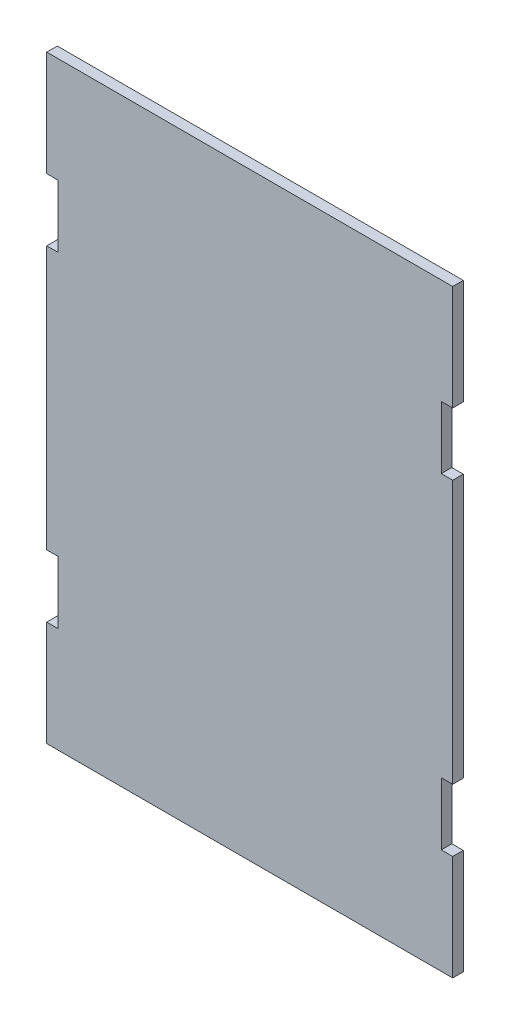
ISO-10303-21;
HEADER;
FILE_DESCRIPTION(('STEP AP214'),'2;1');
FILE_NAME('part.step','',(''),(''),'','','');
FILE_SCHEMA(('AUTOMOTIVE_DESIGN { 1 0 10303 214 1 1 1 1 }'));
ENDSEC;
DATA;
#1=APPLICATION_CONTEXT('core data for automotive mechanical design processes');
#2=APPLICATION_PROTOCOL_DEFINITION('international standard','automotive_design',2000,#1);
#3=PRODUCT_CONTEXT('',#1,'mechanical');
#4=PRODUCT('Part','Part','',(#3));
#5=PRODUCT_RELATED_PRODUCT_CATEGORY('part','',(#4));
#6=PRODUCT_DEFINITION_FORMATION('','',#4);
#7=PRODUCT_DEFINITION_CONTEXT('part definition',#1,'design');
#8=PRODUCT_DEFINITION('design','',#6,#7);
#9=PRODUCT_DEFINITION_SHAPE('','',#8);
#10=(LENGTH_UNIT() NAMED_UNIT(*) SI_UNIT(.MILLI.,.METRE.));
#11=(NAMED_UNIT(*) PLANE_ANGLE_UNIT() SI_UNIT($,.RADIAN.));
#12=(NAMED_UNIT(*) SI_UNIT($,.STERADIAN.) SOLID_ANGLE_UNIT());
#13=UNCERTAINTY_MEASURE_WITH_UNIT(LENGTH_MEASURE(1.E-05),#10,'distance_accuracy_value','');
#14=(GEOMETRIC_REPRESENTATION_CONTEXT(3) GLOBAL_UNCERTAINTY_ASSIGNED_CONTEXT((#13)) GLOBAL_UNIT_ASSIGNED_CONTEXT((#10,
#11,#12)) REPRESENTATION_CONTEXT('',''));
#15=CARTESIAN_POINT('',(0.,0.,0.));
#16=DIRECTION('',(0.,0.,1.));
#17=DIRECTION('',(1.,0.,0.));
#18=AXIS2_PLACEMENT_3D('',#15,#16,#17);
#19=CARTESIAN_POINT('',(-230.5,220.5,12.));
#20=DIRECTION('',(1.,0.,0.));
#21=DIRECTION('',(0.,0.,-1.));
#22=AXIS2_PLACEMENT_3D('',#19,#20,#21);
#23=PLANE('',#22);
#24=DIRECTION('',(0.,-1.,0.));
#25=VECTOR('',#24,1.);
#26=CARTESIAN_POINT('',(-230.5,220.5,0.));
#27=LINE('',#26,#25);
#28=CARTESIAN_POINT('',(-230.5,340.,0.));
#29=VERTEX_POINT('',#28);
#30=CARTESIAN_POINT('',(-230.5,220.5,0.));
#31=VERTEX_POINT('',#30);
#32=EDGE_CURVE('E201',#29,#31,#27,.T.);
#33=ORIENTED_EDGE('',*,*,#32,.T.);
#34=DIRECTION('',(0.,0.,-1.));
#35=VECTOR('',#34,1.);
#36=CARTESIAN_POINT('',(-230.5,220.5,12.));
#37=LINE('',#36,#35);
#38=CARTESIAN_POINT('',(-230.5,220.5,12.));
#39=VERTEX_POINT('',#38);
#40=EDGE_CURVE('E11',#39,#31,#37,.T.);
#41=ORIENTED_EDGE('',*,*,#40,.F.);
#42=DIRECTION('',(0.,-1.,0.));
#43=VECTOR('',#42,1.);
#44=CARTESIAN_POINT('',(-230.5,220.5,12.));
#45=LINE('',#44,#43);
#46=CARTESIAN_POINT('',(-230.5,340.,12.));
#47=VERTEX_POINT('',#46);
#48=EDGE_CURVE('E239',#47,#39,#45,.T.);
#49=ORIENTED_EDGE('',*,*,#48,.F.);
#50=DIRECTION('',(0.,0.,-1.));
#51=VECTOR('',#50,1.);
#52=CARTESIAN_POINT('',(-230.5,340.,12.));
#53=LINE('',#52,#51);
#54=EDGE_CURVE('E197',#47,#29,#53,.T.);
#55=ORIENTED_EDGE('',*,*,#54,.T.);
#56=EDGE_LOOP('',(#33,#41,#49,#55));
#57=FACE_BOUND('',#56,.T.);
#58=ADVANCED_FACE('F33',(#57),#23,.F.);
#59=CARTESIAN_POINT('',(-230.5,220.5,12.));
#60=DIRECTION('',(0.,1.,0.));
#61=DIRECTION('',(0.,0.,1.));
#62=AXIS2_PLACEMENT_3D('',#59,#60,#61);
#63=PLANE('',#62);
#64=DIRECTION('',(1.,0.,0.));
#65=VECTOR('',#64,1.);
#66=CARTESIAN_POINT('',(-230.5,220.5,0.));
#67=LINE('',#66,#65);
#68=CARTESIAN_POINT('',(-217.5,220.5,0.));
#69=VERTEX_POINT('',#68);
#70=EDGE_CURVE('E204',#31,#69,#67,.T.);
#71=ORIENTED_EDGE('',*,*,#70,.T.);
#72=DIRECTION('',(0.,0.,-1.));
#73=VECTOR('',#72,1.);
#74=CARTESIAN_POINT('',(-217.5,220.5,12.));
#75=LINE('',#74,#73);
#76=CARTESIAN_POINT('',(-217.5,220.5,12.));
#77=VERTEX_POINT('',#76);
#78=EDGE_CURVE('E41',#77,#69,#75,.T.);
#79=ORIENTED_EDGE('',*,*,#78,.F.);
#80=DIRECTION('',(1.,0.,0.));
#81=VECTOR('',#80,1.);
#82=CARTESIAN_POINT('',(-230.5,220.5,12.));
#83=LINE('',#82,#81);
#84=EDGE_CURVE('E128',#39,#77,#83,.T.);
#85=ORIENTED_EDGE('',*,*,#84,.F.);
#86=ORIENTED_EDGE('',*,*,#40,.T.);
#87=EDGE_LOOP('',(#71,#79,#85,#86));
#88=FACE_BOUND('',#87,.T.);
#89=ADVANCED_FACE('F357',(#88),#63,.F.);
#90=CARTESIAN_POINT('',(-217.5,220.5,12.));
#91=DIRECTION('',(1.,0.,0.));
#92=DIRECTION('',(0.,0.,-1.));
#93=AXIS2_PLACEMENT_3D('',#90,#91,#92);
#94=PLANE('',#93);
#95=DIRECTION('',(0.,-1.,0.));
#96=VECTOR('',#95,1.);
#97=CARTESIAN_POINT('',(-217.5,220.5,0.));
#98=LINE('',#97,#96);
#99=CARTESIAN_POINT('',(-217.5,149.5,0.));
#100=VERTEX_POINT('',#99);
#101=EDGE_CURVE('E206',#69,#100,#98,.T.);
#102=ORIENTED_EDGE('',*,*,#101,.T.);
#103=DIRECTION('',(0.,0.,-1.));
#104=VECTOR('',#103,1.);
#105=CARTESIAN_POINT('',(-217.5,149.5,12.));
#106=LINE('',#105,#104);
#107=CARTESIAN_POINT('',(-217.5,149.5,12.));
#108=VERTEX_POINT('',#107);
#109=EDGE_CURVE('E282',#108,#100,#106,.T.);
#110=ORIENTED_EDGE('',*,*,#109,.F.);
#111=DIRECTION('',(0.,-1.,0.));
#112=VECTOR('',#111,1.);
#113=CARTESIAN_POINT('',(-217.5,220.5,12.));
#114=LINE('',#113,#112);
#115=EDGE_CURVE('E290',#77,#108,#114,.T.);
#116=ORIENTED_EDGE('',*,*,#115,.F.);
#117=ORIENTED_EDGE('',*,*,#78,.T.);
#118=EDGE_LOOP('',(#102,#110,#116,#117));
#119=FACE_BOUND('',#118,.T.);
#120=ADVANCED_FACE('F288',(#119),#94,.F.);
#121=CARTESIAN_POINT('',(-217.5,149.5,12.));
#122=DIRECTION('',(0.,-1.,0.));
#123=DIRECTION('',(1.,0.,0.));
#124=AXIS2_PLACEMENT_3D('',#121,#122,#123);
#125=PLANE('',#124);
#126=DIRECTION('',(-1.,0.,0.));
#127=VECTOR('',#126,1.);
#128=CARTESIAN_POINT('',(-217.5,149.5,0.));
#129=LINE('',#128,#127);
#130=CARTESIAN_POINT('',(-230.5,149.5,0.));
#131=VERTEX_POINT('',#130);
#132=EDGE_CURVE('E208',#100,#131,#129,.T.);
#133=ORIENTED_EDGE('',*,*,#132,.T.);
#134=DIRECTION('',(0.,0.,-1.));
#135=VECTOR('',#134,1.);
#136=CARTESIAN_POINT('',(-230.5,149.5,12.));
#137=LINE('',#136,#135);
#138=CARTESIAN_POINT('',(-230.5,149.5,12.));
#139=VERTEX_POINT('',#138);
#140=EDGE_CURVE('E279',#139,#131,#137,.T.);
#141=ORIENTED_EDGE('',*,*,#140,.F.);
#142=DIRECTION('',(-1.,0.,0.));
#143=VECTOR('',#142,1.);
#144=CARTESIAN_POINT('',(-217.5,149.5,12.));
#145=LINE('',#144,#143);
#146=EDGE_CURVE('E308',#108,#139,#145,.T.);
#147=ORIENTED_EDGE('',*,*,#146,.F.);
#148=ORIENTED_EDGE('',*,*,#109,.T.);
#149=EDGE_LOOP('',(#133,#141,#147,#148));
#150=FACE_BOUND('',#149,.T.);
#151=ADVANCED_FACE('F299',(#150),#125,.F.);
#152=CARTESIAN_POINT('',(-230.5,-149.5,12.));
#153=DIRECTION('',(1.,0.,0.));
#154=DIRECTION('',(0.,0.,-1.));
#155=AXIS2_PLACEMENT_3D('',#152,#153,#154);
#156=PLANE('',#155);
#157=DIRECTION('',(0.,-1.,0.));
#158=VECTOR('',#157,1.);
#159=CARTESIAN_POINT('',(-230.5,-149.5,0.));
#160=LINE('',#159,#158);
#161=CARTESIAN_POINT('',(-230.5,-149.5,0.));
#162=VERTEX_POINT('',#161);
#163=EDGE_CURVE('E210',#131,#162,#160,.T.);
#164=ORIENTED_EDGE('',*,*,#163,.T.);
#165=DIRECTION('',(0.,0.,-1.));
#166=VECTOR('',#165,1.);
#167=CARTESIAN_POINT('',(-230.5,-149.5,12.));
#168=LINE('',#167,#166);
#169=CARTESIAN_POINT('',(-230.5,-149.5,12.));
#170=VERTEX_POINT('',#169);
#171=EDGE_CURVE('E276',#170,#162,#168,.T.);
#172=ORIENTED_EDGE('',*,*,#171,.F.);
#173=DIRECTION('',(0.,-1.,0.));
#174=VECTOR('',#173,1.);
#175=CARTESIAN_POINT('',(-230.5,-149.5,12.));
#176=LINE('',#175,#174);
#177=EDGE_CURVE('E305',#139,#170,#176,.T.);
#178=ORIENTED_EDGE('',*,*,#177,.F.);
#179=ORIENTED_EDGE('',*,*,#140,.T.);
#180=EDGE_LOOP('',(#164,#172,#178,#179));
#181=FACE_BOUND('',#180,.T.);
#182=ADVANCED_FACE('F303',(#181),#156,.F.);
#183=CARTESIAN_POINT('',(-230.5,-149.5,12.));
#184=DIRECTION('',(0.,1.,0.));
#185=DIRECTION('',(0.,0.,1.));
#186=AXIS2_PLACEMENT_3D('',#183,#184,#185);
#187=PLANE('',#186);
#188=DIRECTION('',(1.,0.,0.));
#189=VECTOR('',#188,1.);
#190=CARTESIAN_POINT('',(-230.5,-149.5,0.));
#191=LINE('',#190,#189);
#192=CARTESIAN_POINT('',(-217.5,-149.5,0.));
#193=VERTEX_POINT('',#192);
#194=EDGE_CURVE('E212',#162,#193,#191,.T.);
#195=ORIENTED_EDGE('',*,*,#194,.T.);
#196=DIRECTION('',(0.,0.,-1.));
#197=VECTOR('',#196,1.);
#198=CARTESIAN_POINT('',(-217.5,-149.5,12.));
#199=LINE('',#198,#197);
#200=CARTESIAN_POINT('',(-217.5,-149.5,12.));
#201=VERTEX_POINT('',#200);
#202=EDGE_CURVE('E273',#201,#193,#199,.T.);
#203=ORIENTED_EDGE('',*,*,#202,.F.);
#204=DIRECTION('',(1.,0.,0.));
#205=VECTOR('',#204,1.);
#206=CARTESIAN_POINT('',(-230.5,-149.5,12.));
#207=LINE('',#206,#205);
#208=EDGE_CURVE('E307',#170,#201,#207,.T.);
#209=ORIENTED_EDGE('',*,*,#208,.F.);
#210=ORIENTED_EDGE('',*,*,#171,.T.);
#211=EDGE_LOOP('',(#195,#203,#209,#210));
#212=FACE_BOUND('',#211,.T.);
#213=ADVANCED_FACE('F370',(#212),#187,.F.);
#214=CARTESIAN_POINT('',(-217.5,-149.5,12.));
#215=DIRECTION('',(1.,0.,0.));
#216=DIRECTION('',(0.,1.,0.));
#217=AXIS2_PLACEMENT_3D('',#214,#215,#216);
#218=PLANE('',#217);
#219=DIRECTION('',(0.,-1.,0.));
#220=VECTOR('',#219,1.);
#221=CARTESIAN_POINT('',(-217.5,-149.5,0.));
#222=LINE('',#221,#220);
#223=CARTESIAN_POINT('',(-217.5,-220.5,0.));
#224=VERTEX_POINT('',#223);
#225=EDGE_CURVE('E214',#193,#224,#222,.T.);
#226=ORIENTED_EDGE('',*,*,#225,.T.);
#227=DIRECTION('',(0.,0.,-1.));
#228=VECTOR('',#227,1.);
#229=CARTESIAN_POINT('',(-217.5,-220.5,12.));
#230=LINE('',#229,#228);
#231=CARTESIAN_POINT('',(-217.5,-220.5,12.));
#232=VERTEX_POINT('',#231);
#233=EDGE_CURVE('E270',#232,#224,#230,.T.);
#234=ORIENTED_EDGE('',*,*,#233,.F.);
#235=DIRECTION('',(0.,-1.,0.));
#236=VECTOR('',#235,1.);
#237=CARTESIAN_POINT('',(-217.5,-149.5,12.));
#238=LINE('',#237,#236);
#239=EDGE_CURVE('E310',#201,#232,#238,.T.);
#240=ORIENTED_EDGE('',*,*,#239,.F.);
#241=ORIENTED_EDGE('',*,*,#202,.T.);
#242=EDGE_LOOP('',(#226,#234,#240,#241));
#243=FACE_BOUND('',#242,.T.);
#244=ADVANCED_FACE('F373',(#243),#218,.F.);
#245=CARTESIAN_POINT('',(-217.5,-220.5,12.));
#246=DIRECTION('',(0.,-1.,0.));
#247=DIRECTION('',(0.,0.,-1.));
#248=AXIS2_PLACEMENT_3D('',#245,#246,#247);
#249=PLANE('',#248);
#250=DIRECTION('',(-1.,0.,0.));
#251=VECTOR('',#250,1.);
#252=CARTESIAN_POINT('',(-217.5,-220.5,0.));
#253=LINE('',#252,#251);
#254=CARTESIAN_POINT('',(-230.5,-220.5,0.));
#255=VERTEX_POINT('',#254);
#256=EDGE_CURVE('E216',#224,#255,#253,.T.);
#257=ORIENTED_EDGE('',*,*,#256,.T.);
#258=DIRECTION('',(0.,0.,-1.));
#259=VECTOR('',#258,1.);
#260=CARTESIAN_POINT('',(-230.5,-220.5,12.));
#261=LINE('',#260,#259);
#262=CARTESIAN_POINT('',(-230.5,-220.5,12.));
#263=VERTEX_POINT('',#262);
#264=EDGE_CURVE('E267',#263,#255,#261,.T.);
#265=ORIENTED_EDGE('',*,*,#264,.F.);
#266=DIRECTION('',(-1.,0.,0.));
#267=VECTOR('',#266,1.);
#268=CARTESIAN_POINT('',(-217.5,-220.5,12.));
#269=LINE('',#268,#267);
#270=EDGE_CURVE('E316',#232,#263,#269,.T.);
#271=ORIENTED_EDGE('',*,*,#270,.F.);
#272=ORIENTED_EDGE('',*,*,#233,.T.);
#273=EDGE_LOOP('',(#257,#265,#271,#272));
#274=FACE_BOUND('',#273,.T.);
#275=ADVANCED_FACE('F377',(#274),#249,.F.);
#276=CARTESIAN_POINT('',(-230.5,-340.,12.));
#277=DIRECTION('',(1.,0.,0.));
#278=DIRECTION('',(0.,0.,-1.));
#279=AXIS2_PLACEMENT_3D('',#276,#277,#278);
#280=PLANE('',#279);
#281=DIRECTION('',(0.,-1.,0.));
#282=VECTOR('',#281,1.);
#283=CARTESIAN_POINT('',(-230.5,-340.,0.));
#284=LINE('',#283,#282);
#285=CARTESIAN_POINT('',(-230.5,-340.,0.));
#286=VERTEX_POINT('',#285);
#287=EDGE_CURVE('E218',#255,#286,#284,.T.);
#288=ORIENTED_EDGE('',*,*,#287,.T.);
#289=DIRECTION('',(0.,0.,-1.));
#290=VECTOR('',#289,1.);
#291=CARTESIAN_POINT('',(-230.5,-340.,12.));
#292=LINE('',#291,#290);
#293=CARTESIAN_POINT('',(-230.5,-340.,12.));
#294=VERTEX_POINT('',#293);
#295=EDGE_CURVE('E264',#294,#286,#292,.T.);
#296=ORIENTED_EDGE('',*,*,#295,.F.);
#297=DIRECTION('',(0.,-1.,0.));
#298=VECTOR('',#297,1.);
#299=CARTESIAN_POINT('',(-230.5,-340.,12.));
#300=LINE('',#299,#298);
#301=EDGE_CURVE('E318',#263,#294,#300,.T.);
#302=ORIENTED_EDGE('',*,*,#301,.F.);
#303=ORIENTED_EDGE('',*,*,#264,.T.);
#304=EDGE_LOOP('',(#288,#296,#302,#303));
#305=FACE_BOUND('',#304,.T.);
#306=ADVANCED_FACE('F381',(#305),#280,.F.);
#307=CARTESIAN_POINT('',(230.5,-340.,12.));
#308=DIRECTION('',(0.,1.,0.));
#309=DIRECTION('',(-1.,0.,0.));
#310=AXIS2_PLACEMENT_3D('',#307,#308,#309);
#311=PLANE('',#310);
#312=DIRECTION('',(1.,0.,0.));
#313=VECTOR('',#312,1.);
#314=CARTESIAN_POINT('',(230.5,-340.,0.));
#315=LINE('',#314,#313);
#316=CARTESIAN_POINT('',(230.5,-340.,0.));
#317=VERTEX_POINT('',#316);
#318=EDGE_CURVE('E220',#286,#317,#315,.T.);
#319=ORIENTED_EDGE('',*,*,#318,.T.);
#320=DIRECTION('',(0.,0.,-1.));
#321=VECTOR('',#320,1.);
#322=CARTESIAN_POINT('',(230.5,-340.,12.));
#323=LINE('',#322,#321);
#324=CARTESIAN_POINT('',(230.5,-340.,12.));
#325=VERTEX_POINT('',#324);
#326=EDGE_CURVE('E261',#325,#317,#323,.T.);
#327=ORIENTED_EDGE('',*,*,#326,.F.);
#328=DIRECTION('',(1.,0.,0.));
#329=VECTOR('',#328,1.);
#330=CARTESIAN_POINT('',(230.5,-340.,12.));
#331=LINE('',#330,#329);
#332=EDGE_CURVE('E320',#294,#325,#331,.T.);
#333=ORIENTED_EDGE('',*,*,#332,.F.);
#334=ORIENTED_EDGE('',*,*,#295,.T.);
#335=EDGE_LOOP('',(#319,#327,#333,#334));
#336=FACE_BOUND('',#335,.T.);
#337=ADVANCED_FACE('F385',(#336),#311,.F.);
#338=CARTESIAN_POINT('',(230.5,-340.,12.));
#339=DIRECTION('',(-1.,0.,0.));
#340=DIRECTION('',(0.,0.,1.));
#341=AXIS2_PLACEMENT_3D('',#338,#339,#340);
#342=PLANE('',#341);
#343=DIRECTION('',(0.,1.,0.));
#344=VECTOR('',#343,1.);
#345=CARTESIAN_POINT('',(230.5,-340.,0.));
#346=LINE('',#345,#344);
#347=CARTESIAN_POINT('',(230.5,-220.5,0.));
#348=VERTEX_POINT('',#347);
#349=EDGE_CURVE('E222',#317,#348,#346,.T.);
#350=ORIENTED_EDGE('',*,*,#349,.T.);
#351=DIRECTION('',(0.,0.,-1.));
#352=VECTOR('',#351,1.);
#353=CARTESIAN_POINT('',(230.5,-220.5,12.));
#354=LINE('',#353,#352);
#355=CARTESIAN_POINT('',(230.5,-220.5,12.));
#356=VERTEX_POINT('',#355);
#357=EDGE_CURVE('E258',#356,#348,#354,.T.);
#358=ORIENTED_EDGE('',*,*,#357,.F.);
#359=DIRECTION('',(0.,1.,0.));
#360=VECTOR('',#359,1.);
#361=CARTESIAN_POINT('',(230.5,-340.,12.));
#362=LINE('',#361,#360);
#363=EDGE_CURVE('E322',#325,#356,#362,.T.);
#364=ORIENTED_EDGE('',*,*,#363,.F.);
#365=ORIENTED_EDGE('',*,*,#326,.T.);
#366=EDGE_LOOP('',(#350,#358,#364,#365));
#367=FACE_BOUND('',#366,.T.);
#368=ADVANCED_FACE('F389',(#367),#342,.F.);
#369=CARTESIAN_POINT('',(230.5,-220.5,12.));
#370=DIRECTION('',(0.,-1.,0.));
#371=DIRECTION('',(0.,0.,-1.));
#372=AXIS2_PLACEMENT_3D('',#369,#370,#371);
#373=PLANE('',#372);
#374=DIRECTION('',(-1.,0.,0.));
#375=VECTOR('',#374,1.);
#376=CARTESIAN_POINT('',(230.5,-220.5,0.));
#377=LINE('',#376,#375);
#378=CARTESIAN_POINT('',(217.5,-220.5,0.));
#379=VERTEX_POINT('',#378);
#380=EDGE_CURVE('E224',#348,#379,#377,.T.);
#381=ORIENTED_EDGE('',*,*,#380,.T.);
#382=DIRECTION('',(0.,0.,-1.));
#383=VECTOR('',#382,1.);
#384=CARTESIAN_POINT('',(217.5,-220.5,12.));
#385=LINE('',#384,#383);
#386=CARTESIAN_POINT('',(217.5,-220.5,12.));
#387=VERTEX_POINT('',#386);
#388=EDGE_CURVE('E255',#387,#379,#385,.T.);
#389=ORIENTED_EDGE('',*,*,#388,.F.);
#390=DIRECTION('',(-1.,0.,0.));
#391=VECTOR('',#390,1.);
#392=CARTESIAN_POINT('',(230.5,-220.5,12.));
#393=LINE('',#392,#391);
#394=EDGE_CURVE('E324',#356,#387,#393,.T.);
#395=ORIENTED_EDGE('',*,*,#394,.F.);
#396=ORIENTED_EDGE('',*,*,#357,.T.);
#397=EDGE_LOOP('',(#381,#389,#395,#396));
#398=FACE_BOUND('',#397,.T.);
#399=ADVANCED_FACE('F393',(#398),#373,.F.);
#400=CARTESIAN_POINT('',(217.5,-220.5,12.));
#401=DIRECTION('',(-1.,0.,0.));
#402=DIRECTION('',(0.,0.,1.));
#403=AXIS2_PLACEMENT_3D('',#400,#401,#402);
#404=PLANE('',#403);
#405=DIRECTION('',(0.,1.,0.));
#406=VECTOR('',#405,1.);
#407=CARTESIAN_POINT('',(217.5,-220.5,0.));
#408=LINE('',#407,#406);
#409=CARTESIAN_POINT('',(217.5,-149.5,0.));
#410=VERTEX_POINT('',#409);
#411=EDGE_CURVE('E226',#379,#410,#408,.T.);
#412=ORIENTED_EDGE('',*,*,#411,.T.);
#413=DIRECTION('',(0.,0.,-1.));
#414=VECTOR('',#413,1.);
#415=CARTESIAN_POINT('',(217.5,-149.5,12.));
#416=LINE('',#415,#414);
#417=CARTESIAN_POINT('',(217.5,-149.5,12.));
#418=VERTEX_POINT('',#417);
#419=EDGE_CURVE('E252',#418,#410,#416,.T.);
#420=ORIENTED_EDGE('',*,*,#419,.F.);
#421=DIRECTION('',(0.,1.,0.));
#422=VECTOR('',#421,1.);
#423=CARTESIAN_POINT('',(217.5,-220.5,12.));
#424=LINE('',#423,#422);
#425=EDGE_CURVE('E326',#387,#418,#424,.T.);
#426=ORIENTED_EDGE('',*,*,#425,.F.);
#427=ORIENTED_EDGE('',*,*,#388,.T.);
#428=EDGE_LOOP('',(#412,#420,#426,#427));
#429=FACE_BOUND('',#428,.T.);
#430=ADVANCED_FACE('F397',(#429),#404,.F.);
#431=CARTESIAN_POINT('',(217.5,-149.5,12.));
#432=DIRECTION('',(0.,1.,0.));
#433=DIRECTION('',(0.,0.,1.));
#434=AXIS2_PLACEMENT_3D('',#431,#432,#433);
#435=PLANE('',#434);
#436=DIRECTION('',(1.,0.,0.));
#437=VECTOR('',#436,1.);
#438=CARTESIAN_POINT('',(217.5,-149.5,0.));
#439=LINE('',#438,#437);
#440=CARTESIAN_POINT('',(230.5,-149.5,0.));
#441=VERTEX_POINT('',#440);
#442=EDGE_CURVE('E228',#410,#441,#439,.T.);
#443=ORIENTED_EDGE('',*,*,#442,.T.);
#444=DIRECTION('',(0.,0.,-1.));
#445=VECTOR('',#444,1.);
#446=CARTESIAN_POINT('',(230.5,-149.5,12.));
#447=LINE('',#446,#445);
#448=CARTESIAN_POINT('',(230.5,-149.5,12.));
#449=VERTEX_POINT('',#448);
#450=EDGE_CURVE('E249',#449,#441,#447,.T.);
#451=ORIENTED_EDGE('',*,*,#450,.F.);
#452=DIRECTION('',(1.,0.,0.));
#453=VECTOR('',#452,1.);
#454=CARTESIAN_POINT('',(217.5,-149.5,12.));
#455=LINE('',#454,#453);
#456=EDGE_CURVE('E328',#418,#449,#455,.T.);
#457=ORIENTED_EDGE('',*,*,#456,.F.);
#458=ORIENTED_EDGE('',*,*,#419,.T.);
#459=EDGE_LOOP('',(#443,#451,#457,#458));
#460=FACE_BOUND('',#459,.T.);
#461=ADVANCED_FACE('F401',(#460),#435,.F.);
#462=CARTESIAN_POINT('',(230.5,-149.5,12.));
#463=DIRECTION('',(-1.,0.,0.));
#464=DIRECTION('',(0.,0.,1.));
#465=AXIS2_PLACEMENT_3D('',#462,#463,#464);
#466=PLANE('',#465);
#467=DIRECTION('',(0.,1.,0.));
#468=VECTOR('',#467,1.);
#469=CARTESIAN_POINT('',(230.5,-149.5,0.));
#470=LINE('',#469,#468);
#471=CARTESIAN_POINT('',(230.5,149.5,0.));
#472=VERTEX_POINT('',#471);
#473=EDGE_CURVE('E230',#441,#472,#470,.T.);
#474=ORIENTED_EDGE('',*,*,#473,.T.);
#475=DIRECTION('',(0.,0.,-1.));
#476=VECTOR('',#475,1.);
#477=CARTESIAN_POINT('',(230.5,149.5,12.));
#478=LINE('',#477,#476);
#479=CARTESIAN_POINT('',(230.5,149.5,12.));
#480=VERTEX_POINT('',#479);
#481=EDGE_CURVE('E246',#480,#472,#478,.T.);
#482=ORIENTED_EDGE('',*,*,#481,.F.);
#483=DIRECTION('',(0.,1.,0.));
#484=VECTOR('',#483,1.);
#485=CARTESIAN_POINT('',(230.5,-149.5,12.));
#486=LINE('',#485,#484);
#487=EDGE_CURVE('E330',#449,#480,#486,.T.);
#488=ORIENTED_EDGE('',*,*,#487,.F.);
#489=ORIENTED_EDGE('',*,*,#450,.T.);
#490=EDGE_LOOP('',(#474,#482,#488,#489));
#491=FACE_BOUND('',#490,.T.);
#492=ADVANCED_FACE('F405',(#491),#466,.F.);
#493=CARTESIAN_POINT('',(230.5,149.5,12.));
#494=DIRECTION('',(0.,-1.,0.));
#495=DIRECTION('',(0.,0.,-1.));
#496=AXIS2_PLACEMENT_3D('',#493,#494,#495);
#497=PLANE('',#496);
#498=DIRECTION('',(-1.,0.,0.));
#499=VECTOR('',#498,1.);
#500=CARTESIAN_POINT('',(230.5,149.5,0.));
#501=LINE('',#500,#499);
#502=CARTESIAN_POINT('',(217.5,149.5,0.));
#503=VERTEX_POINT('',#502);
#504=EDGE_CURVE('E232',#472,#503,#501,.T.);
#505=ORIENTED_EDGE('',*,*,#504,.T.);
#506=DIRECTION('',(0.,0.,-1.));
#507=VECTOR('',#506,1.);
#508=CARTESIAN_POINT('',(217.5,149.5,12.));
#509=LINE('',#508,#507);
#510=CARTESIAN_POINT('',(217.5,149.5,12.));
#511=VERTEX_POINT('',#510);
#512=EDGE_CURVE('E243',#511,#503,#509,.T.);
#513=ORIENTED_EDGE('',*,*,#512,.F.);
#514=DIRECTION('',(-1.,0.,0.));
#515=VECTOR('',#514,1.);
#516=CARTESIAN_POINT('',(230.5,149.5,12.));
#517=LINE('',#516,#515);
#518=EDGE_CURVE('E332',#480,#511,#517,.T.);
#519=ORIENTED_EDGE('',*,*,#518,.F.);
#520=ORIENTED_EDGE('',*,*,#481,.T.);
#521=EDGE_LOOP('',(#505,#513,#519,#520));
#522=FACE_BOUND('',#521,.T.);
#523=ADVANCED_FACE('F338',(#522),#497,.F.);
#524=CARTESIAN_POINT('',(217.5,149.5,12.));
#525=DIRECTION('',(-1.,0.,0.));
#526=DIRECTION('',(0.,0.,1.));
#527=AXIS2_PLACEMENT_3D('',#524,#525,#526);
#528=PLANE('',#527);
#529=DIRECTION('',(0.,1.,0.));
#530=VECTOR('',#529,1.);
#531=CARTESIAN_POINT('',(217.5,149.5,0.));
#532=LINE('',#531,#530);
#533=CARTESIAN_POINT('',(217.5,220.5,0.));
#534=VERTEX_POINT('',#533);
#535=EDGE_CURVE('E234',#503,#534,#532,.T.);
#536=ORIENTED_EDGE('',*,*,#535,.T.);
#537=DIRECTION('',(0.,0.,-1.));
#538=VECTOR('',#537,1.);
#539=CARTESIAN_POINT('',(217.5,220.5,12.));
#540=LINE('',#539,#538);
#541=CARTESIAN_POINT('',(217.5,220.5,12.));
#542=VERTEX_POINT('',#541);
#543=EDGE_CURVE('E192',#542,#534,#540,.T.);
#544=ORIENTED_EDGE('',*,*,#543,.F.);
#545=DIRECTION('',(0.,1.,0.));
#546=VECTOR('',#545,1.);
#547=CARTESIAN_POINT('',(217.5,149.5,12.));
#548=LINE('',#547,#546);
#549=EDGE_CURVE('E183',#511,#542,#548,.T.);
#550=ORIENTED_EDGE('',*,*,#549,.F.);
#551=ORIENTED_EDGE('',*,*,#512,.T.);
#552=EDGE_LOOP('',(#536,#544,#550,#551));
#553=FACE_BOUND('',#552,.T.);
#554=ADVANCED_FACE('F342',(#553),#528,.F.);
#555=CARTESIAN_POINT('',(217.5,220.5,12.));
#556=DIRECTION('',(0.,1.,0.));
#557=DIRECTION('',(0.,0.,1.));
#558=AXIS2_PLACEMENT_3D('',#555,#556,#557);
#559=PLANE('',#558);
#560=DIRECTION('',(1.,0.,0.));
#561=VECTOR('',#560,1.);
#562=CARTESIAN_POINT('',(217.5,220.5,0.));
#563=LINE('',#562,#561);
#564=CARTESIAN_POINT('',(230.5,220.5,0.));
#565=VERTEX_POINT('',#564);
#566=EDGE_CURVE('E191',#534,#565,#563,.T.);
#567=ORIENTED_EDGE('',*,*,#566,.T.);
#568=DIRECTION('',(0.,0.,-1.));
#569=VECTOR('',#568,1.);
#570=CARTESIAN_POINT('',(230.5,220.5,12.));
#571=LINE('',#570,#569);
#572=CARTESIAN_POINT('',(230.5,220.5,12.));
#573=VERTEX_POINT('',#572);
#574=EDGE_CURVE('E188',#573,#565,#571,.T.);
#575=ORIENTED_EDGE('',*,*,#574,.F.);
#576=DIRECTION('',(1.,0.,0.));
#577=VECTOR('',#576,1.);
#578=CARTESIAN_POINT('',(217.5,220.5,12.));
#579=LINE('',#578,#577);
#580=EDGE_CURVE('E177',#542,#573,#579,.T.);
#581=ORIENTED_EDGE('',*,*,#580,.F.);
#582=ORIENTED_EDGE('',*,*,#543,.T.);
#583=EDGE_LOOP('',(#567,#575,#581,#582));
#584=FACE_BOUND('',#583,.T.);
#585=ADVANCED_FACE('F189',(#584),#559,.F.);
#586=CARTESIAN_POINT('',(230.5,220.5,12.));
#587=DIRECTION('',(-1.,0.,0.));
#588=DIRECTION('',(0.,0.,1.));
#589=AXIS2_PLACEMENT_3D('',#586,#587,#588);
#590=PLANE('',#589);
#591=DIRECTION('',(0.,1.,0.));
#592=VECTOR('',#591,1.);
#593=CARTESIAN_POINT('',(230.5,220.5,0.));
#594=LINE('',#593,#592);
#595=CARTESIAN_POINT('',(230.5,340.,0.));
#596=VERTEX_POINT('',#595);
#597=EDGE_CURVE('E114',#565,#596,#594,.T.);
#598=ORIENTED_EDGE('',*,*,#597,.T.);
#599=DIRECTION('',(0.,0.,-1.));
#600=VECTOR('',#599,1.);
#601=CARTESIAN_POINT('',(230.5,340.,12.));
#602=LINE('',#601,#600);
#603=CARTESIAN_POINT('',(230.5,340.,12.));
#604=VERTEX_POINT('',#603);
#605=EDGE_CURVE('E193',#604,#596,#602,.T.);
#606=ORIENTED_EDGE('',*,*,#605,.F.);
#607=DIRECTION('',(0.,1.,0.));
#608=VECTOR('',#607,1.);
#609=CARTESIAN_POINT('',(230.5,220.5,12.));
#610=LINE('',#609,#608);
#611=EDGE_CURVE('E181',#573,#604,#610,.T.);
#612=ORIENTED_EDGE('',*,*,#611,.F.);
#613=ORIENTED_EDGE('',*,*,#574,.T.);
#614=EDGE_LOOP('',(#598,#606,#612,#613));
#615=FACE_BOUND('',#614,.T.);
#616=ADVANCED_FACE('F195',(#615),#590,.F.);
#617=CARTESIAN_POINT('',(230.5,340.,12.));
#618=DIRECTION('',(0.,-1.,0.));
#619=DIRECTION('',(1.,0.,0.));
#620=AXIS2_PLACEMENT_3D('',#617,#618,#619);
#621=PLANE('',#620);
#622=DIRECTION('',(-1.,0.,0.));
#623=VECTOR('',#622,1.);
#624=CARTESIAN_POINT('',(230.5,340.,0.));
#625=LINE('',#624,#623);
#626=EDGE_CURVE('E120',#596,#29,#625,.T.);
#627=ORIENTED_EDGE('',*,*,#626,.T.);
#628=ORIENTED_EDGE('',*,*,#54,.F.);
#629=DIRECTION('',(-1.,0.,0.));
#630=VECTOR('',#629,1.);
#631=CARTESIAN_POINT('',(230.5,340.,12.));
#632=LINE('',#631,#630);
#633=EDGE_CURVE('E49',#604,#47,#632,.T.);
#634=ORIENTED_EDGE('',*,*,#633,.F.);
#635=ORIENTED_EDGE('',*,*,#605,.T.);
#636=EDGE_LOOP('',(#627,#628,#634,#635));
#637=FACE_BOUND('',#636,.T.);
#638=ADVANCED_FACE('F346',(#637),#621,.F.);
#639=CARTESIAN_POINT('',(0.,0.,12.));
#640=DIRECTION('',(0.,0.,1.));
#641=DIRECTION('',(1.,0.,0.));
#642=AXIS2_PLACEMENT_3D('',#639,#640,#641);
#643=PLANE('',#642);
#644=ORIENTED_EDGE('',*,*,#48,.T.);
#645=ORIENTED_EDGE('',*,*,#84,.T.);
#646=ORIENTED_EDGE('',*,*,#115,.T.);
#647=ORIENTED_EDGE('',*,*,#146,.T.);
#648=ORIENTED_EDGE('',*,*,#177,.T.);
#649=ORIENTED_EDGE('',*,*,#208,.T.);
#650=ORIENTED_EDGE('',*,*,#239,.T.);
#651=ORIENTED_EDGE('',*,*,#270,.T.);
#652=ORIENTED_EDGE('',*,*,#301,.T.);
#653=ORIENTED_EDGE('',*,*,#332,.T.);
#654=ORIENTED_EDGE('',*,*,#363,.T.);
#655=ORIENTED_EDGE('',*,*,#394,.T.);
#656=ORIENTED_EDGE('',*,*,#425,.T.);
#657=ORIENTED_EDGE('',*,*,#456,.T.);
#658=ORIENTED_EDGE('',*,*,#487,.T.);
#659=ORIENTED_EDGE('',*,*,#518,.T.);
#660=ORIENTED_EDGE('',*,*,#549,.T.);
#661=ORIENTED_EDGE('',*,*,#580,.T.);
#662=ORIENTED_EDGE('',*,*,#611,.T.);
#663=ORIENTED_EDGE('',*,*,#633,.T.);
#664=EDGE_LOOP('',(#644,#645,#646,#647,#648,#649,#650,#651,#652,#653,#654,#655,#656,#657,#658,
#659,#660,#661,#662,#663));
#665=FACE_BOUND('',#664,.T.);
#666=ADVANCED_FACE('F179',(#665),#643,.T.);
#667=CARTESIAN_POINT('',(0.,0.,0.));
#668=DIRECTION('',(0.,0.,1.));
#669=DIRECTION('',(1.,0.,0.));
#670=AXIS2_PLACEMENT_3D('',#667,#668,#669);
#671=PLANE('',#670);
#672=ORIENTED_EDGE('',*,*,#32,.F.);
#673=ORIENTED_EDGE('',*,*,#626,.F.);
#674=ORIENTED_EDGE('',*,*,#597,.F.);
#675=ORIENTED_EDGE('',*,*,#566,.F.);
#676=ORIENTED_EDGE('',*,*,#535,.F.);
#677=ORIENTED_EDGE('',*,*,#504,.F.);
#678=ORIENTED_EDGE('',*,*,#473,.F.);
#679=ORIENTED_EDGE('',*,*,#442,.F.);
#680=ORIENTED_EDGE('',*,*,#411,.F.);
#681=ORIENTED_EDGE('',*,*,#380,.F.);
#682=ORIENTED_EDGE('',*,*,#349,.F.);
#683=ORIENTED_EDGE('',*,*,#318,.F.);
#684=ORIENTED_EDGE('',*,*,#287,.F.);
#685=ORIENTED_EDGE('',*,*,#256,.F.);
#686=ORIENTED_EDGE('',*,*,#225,.F.);
#687=ORIENTED_EDGE('',*,*,#194,.F.);
#688=ORIENTED_EDGE('',*,*,#163,.F.);
#689=ORIENTED_EDGE('',*,*,#132,.F.);
#690=ORIENTED_EDGE('',*,*,#101,.F.);
#691=ORIENTED_EDGE('',*,*,#70,.F.);
#692=EDGE_LOOP('',(#672,#673,#674,#675,#676,#677,#678,#679,#680,#681,#682,#683,#684,#685,#686,
#687,#688,#689,#690,#691));
#693=FACE_BOUND('',#692,.T.);
#694=ADVANCED_FACE('F294',(#693),#671,.F.);
#695=CLOSED_SHELL('',(#58,#89,#120,#151,#182,#213,#244,#275,#306,#337,#368,#399,#430,#461,#492,
#523,#554,#585,#616,#638,#666,#694));
#696=MANIFOLD_SOLID_BREP('B2',#695);
#697=ADVANCED_BREP_SHAPE_REPRESENTATION('',(#18,#696),#14);
#698=SHAPE_DEFINITION_REPRESENTATION(#9,#697);
ENDSEC;
END-ISO-10303-21;
